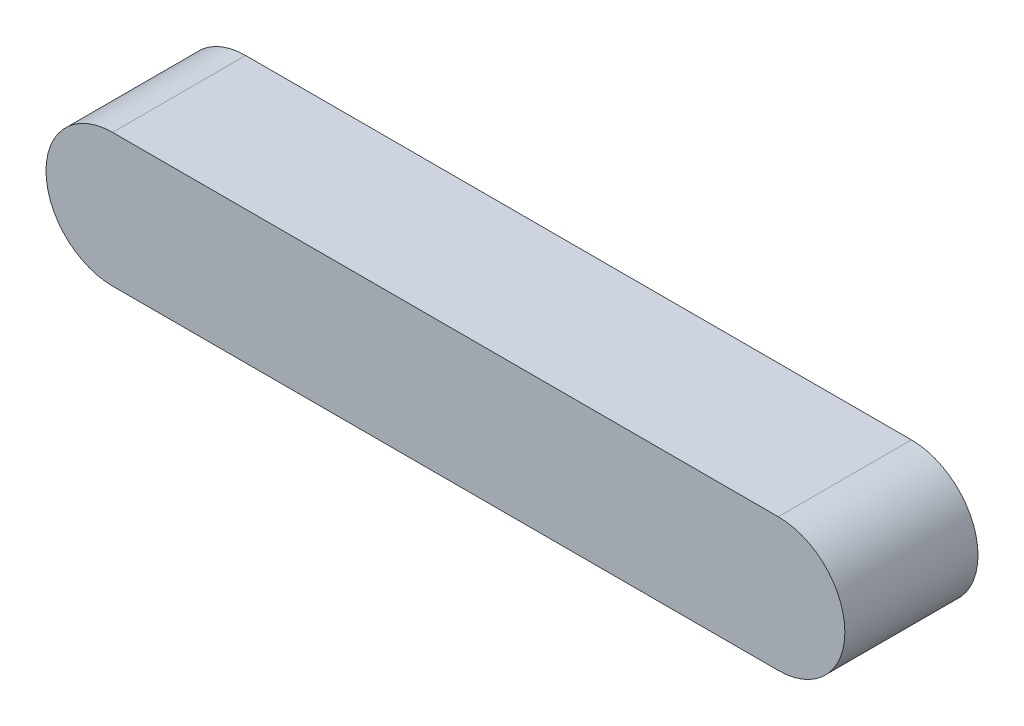
ISO-10303-21;
HEADER;
FILE_DESCRIPTION(('STEP AP214'),'2;1');
FILE_NAME('part.step','',(''),(''),'','','');
FILE_SCHEMA(('AUTOMOTIVE_DESIGN { 1 0 10303 214 1 1 1 1 }'));
ENDSEC;
DATA;
#1=APPLICATION_CONTEXT('core data for automotive mechanical design processes');
#2=APPLICATION_PROTOCOL_DEFINITION('international standard','automotive_design',2000,#1);
#3=PRODUCT_CONTEXT('',#1,'mechanical');
#4=PRODUCT('Part','Part','',(#3));
#5=PRODUCT_RELATED_PRODUCT_CATEGORY('part','',(#4));
#6=PRODUCT_DEFINITION_FORMATION('','',#4);
#7=PRODUCT_DEFINITION_CONTEXT('part definition',#1,'design');
#8=PRODUCT_DEFINITION('design','',#6,#7);
#9=PRODUCT_DEFINITION_SHAPE('','',#8);
#10=(LENGTH_UNIT() NAMED_UNIT(*) SI_UNIT(.MILLI.,.METRE.));
#11=(NAMED_UNIT(*) PLANE_ANGLE_UNIT() SI_UNIT($,.RADIAN.));
#12=(NAMED_UNIT(*) SI_UNIT($,.STERADIAN.) SOLID_ANGLE_UNIT());
#13=UNCERTAINTY_MEASURE_WITH_UNIT(LENGTH_MEASURE(1.E-05),#10,'distance_accuracy_value','');
#14=(GEOMETRIC_REPRESENTATION_CONTEXT(3) GLOBAL_UNCERTAINTY_ASSIGNED_CONTEXT((#13)) GLOBAL_UNIT_ASSIGNED_CONTEXT((#10,
#11,#12)) REPRESENTATION_CONTEXT('',''));
#15=CARTESIAN_POINT('',(0.,0.,0.));
#16=DIRECTION('',(0.,0.,1.));
#17=DIRECTION('',(1.,0.,0.));
#18=AXIS2_PLACEMENT_3D('',#15,#16,#17);
#19=CARTESIAN_POINT('',(0.,0.,12.7));
#20=DIRECTION('',(0.,0.,-1.));
#21=DIRECTION('',(-1.,0.,0.));
#22=AXIS2_PLACEMENT_3D('',#19,#20,#21);
#23=CYLINDRICAL_SURFACE('',#22,6.35);
#24=CARTESIAN_POINT('',(0.,0.,0.));
#25=DIRECTION('',(0.,0.,1.));
#26=DIRECTION('',(1.,0.,0.));
#27=AXIS2_PLACEMENT_3D('',#24,#25,#26);
#28=CIRCLE('',#27,6.35);
#29=CARTESIAN_POINT('',(0.,6.35,0.));
#30=VERTEX_POINT('',#29);
#31=CARTESIAN_POINT('',(0.,-6.35,0.));
#32=VERTEX_POINT('',#31);
#33=EDGE_CURVE('E104',#30,#32,#28,.T.);
#34=ORIENTED_EDGE('',*,*,#33,.T.);
#35=DIRECTION('',(0.,0.,-1.));
#36=VECTOR('',#35,1.);
#37=CARTESIAN_POINT('',(0.,-6.35,12.7));
#38=LINE('',#37,#36);
#39=CARTESIAN_POINT('',(0.,-6.35,12.7));
#40=VERTEX_POINT('',#39);
#41=EDGE_CURVE('E11',#40,#32,#38,.T.);
#42=ORIENTED_EDGE('',*,*,#41,.F.);
#43=CARTESIAN_POINT('',(0.,0.,12.7));
#44=DIRECTION('',(0.,0.,1.));
#45=DIRECTION('',(1.,0.,0.));
#46=AXIS2_PLACEMENT_3D('',#43,#44,#45);
#47=CIRCLE('',#46,6.35);
#48=CARTESIAN_POINT('',(0.,6.35,12.7));
#49=VERTEX_POINT('',#48);
#50=EDGE_CURVE('E92',#49,#40,#47,.T.);
#51=ORIENTED_EDGE('',*,*,#50,.F.);
#52=DIRECTION('',(0.,0.,-1.));
#53=VECTOR('',#52,1.);
#54=CARTESIAN_POINT('',(0.,6.35,12.7));
#55=LINE('',#54,#53);
#56=EDGE_CURVE('E100',#49,#30,#55,.T.);
#57=ORIENTED_EDGE('',*,*,#56,.T.);
#58=EDGE_LOOP('',(#34,#42,#51,#57));
#59=FACE_BOUND('',#58,.T.);
#60=ADVANCED_FACE('F41',(#59),#23,.T.);
#61=CARTESIAN_POINT('',(0.,-6.35,12.7));
#62=DIRECTION('',(0.,1.,0.));
#63=DIRECTION('',(0.,0.,1.));
#64=AXIS2_PLACEMENT_3D('',#61,#62,#63);
#65=PLANE('',#64);
#66=DIRECTION('',(1.,0.,0.));
#67=VECTOR('',#66,1.);
#68=CARTESIAN_POINT('',(0.,-6.35,0.));
#69=LINE('',#68,#67);
#70=CARTESIAN_POINT('',(63.5,-6.35,0.));
#71=VERTEX_POINT('',#70);
#72=EDGE_CURVE('E96',#32,#71,#69,.T.);
#73=ORIENTED_EDGE('',*,*,#72,.T.);
#74=DIRECTION('',(0.,0.,-1.));
#75=VECTOR('',#74,1.);
#76=CARTESIAN_POINT('',(63.5,-6.35,12.7));
#77=LINE('',#76,#75);
#78=CARTESIAN_POINT('',(63.5,-6.35,12.7));
#79=VERTEX_POINT('',#78);
#80=EDGE_CURVE('E49',#79,#71,#77,.T.);
#81=ORIENTED_EDGE('',*,*,#80,.F.);
#82=DIRECTION('',(1.,0.,0.));
#83=VECTOR('',#82,1.);
#84=CARTESIAN_POINT('',(0.,-6.35,12.7));
#85=LINE('',#84,#83);
#86=EDGE_CURVE('E87',#40,#79,#85,.T.);
#87=ORIENTED_EDGE('',*,*,#86,.F.);
#88=ORIENTED_EDGE('',*,*,#41,.T.);
#89=EDGE_LOOP('',(#73,#81,#87,#88));
#90=FACE_BOUND('',#89,.T.);
#91=ADVANCED_FACE('F95',(#90),#65,.F.);
#92=CARTESIAN_POINT('',(63.5,0.,12.7));
#93=DIRECTION('',(0.,0.,-1.));
#94=DIRECTION('',(-1.,0.,0.));
#95=AXIS2_PLACEMENT_3D('',#92,#93,#94);
#96=CYLINDRICAL_SURFACE('',#95,6.35);
#97=CARTESIAN_POINT('',(63.5,0.,0.));
#98=DIRECTION('',(0.,0.,1.));
#99=DIRECTION('',(1.,0.,0.));
#100=AXIS2_PLACEMENT_3D('',#97,#98,#99);
#101=CIRCLE('',#100,6.35);
#102=CARTESIAN_POINT('',(63.5,6.35,0.));
#103=VERTEX_POINT('',#102);
#104=EDGE_CURVE('E74',#71,#103,#101,.T.);
#105=ORIENTED_EDGE('',*,*,#104,.T.);
#106=DIRECTION('',(0.,0.,-1.));
#107=VECTOR('',#106,1.);
#108=CARTESIAN_POINT('',(63.5,6.35,12.7));
#109=LINE('',#108,#107);
#110=CARTESIAN_POINT('',(63.5,6.35,12.7));
#111=VERTEX_POINT('',#110);
#112=EDGE_CURVE('E97',#111,#103,#109,.T.);
#113=ORIENTED_EDGE('',*,*,#112,.F.);
#114=CARTESIAN_POINT('',(63.5,0.,12.7));
#115=DIRECTION('',(0.,0.,1.));
#116=DIRECTION('',(1.,0.,0.));
#117=AXIS2_PLACEMENT_3D('',#114,#115,#116);
#118=CIRCLE('',#117,6.35);
#119=EDGE_CURVE('E90',#79,#111,#118,.T.);
#120=ORIENTED_EDGE('',*,*,#119,.F.);
#121=ORIENTED_EDGE('',*,*,#80,.T.);
#122=EDGE_LOOP('',(#105,#113,#120,#121));
#123=FACE_BOUND('',#122,.T.);
#124=ADVANCED_FACE('F98',(#123),#96,.T.);
#125=CARTESIAN_POINT('',(0.,6.35,12.7));
#126=DIRECTION('',(0.,-1.,0.));
#127=DIRECTION('',(0.,0.,-1.));
#128=AXIS2_PLACEMENT_3D('',#125,#126,#127);
#129=PLANE('',#128);
#130=DIRECTION('',(-1.,0.,0.));
#131=VECTOR('',#130,1.);
#132=CARTESIAN_POINT('',(0.,6.35,0.));
#133=LINE('',#132,#131);
#134=EDGE_CURVE('E80',#103,#30,#133,.T.);
#135=ORIENTED_EDGE('',*,*,#134,.T.);
#136=ORIENTED_EDGE('',*,*,#56,.F.);
#137=DIRECTION('',(-1.,0.,0.));
#138=VECTOR('',#137,1.);
#139=CARTESIAN_POINT('',(0.,6.35,12.7));
#140=LINE('',#139,#138);
#141=EDGE_CURVE('E57',#111,#49,#140,.T.);
#142=ORIENTED_EDGE('',*,*,#141,.F.);
#143=ORIENTED_EDGE('',*,*,#112,.T.);
#144=EDGE_LOOP('',(#135,#136,#142,#143));
#145=FACE_BOUND('',#144,.T.);
#146=ADVANCED_FACE('F111',(#145),#129,.F.);
#147=CARTESIAN_POINT('',(0.,0.,12.7));
#148=DIRECTION('',(0.,0.,1.));
#149=DIRECTION('',(1.,0.,0.));
#150=AXIS2_PLACEMENT_3D('',#147,#148,#149);
#151=PLANE('',#150);
#152=ORIENTED_EDGE('',*,*,#50,.T.);
#153=ORIENTED_EDGE('',*,*,#86,.T.);
#154=ORIENTED_EDGE('',*,*,#119,.T.);
#155=ORIENTED_EDGE('',*,*,#141,.T.);
#156=EDGE_LOOP('',(#152,#153,#154,#155));
#157=FACE_BOUND('',#156,.T.);
#158=ADVANCED_FACE('F88',(#157),#151,.T.);
#159=CARTESIAN_POINT('',(0.,0.,0.));
#160=DIRECTION('',(0.,0.,1.));
#161=DIRECTION('',(1.,0.,0.));
#162=AXIS2_PLACEMENT_3D('',#159,#160,#161);
#163=PLANE('',#162);
#164=ORIENTED_EDGE('',*,*,#33,.F.);
#165=ORIENTED_EDGE('',*,*,#134,.F.);
#166=ORIENTED_EDGE('',*,*,#104,.F.);
#167=ORIENTED_EDGE('',*,*,#72,.F.);
#168=EDGE_LOOP('',(#164,#165,#166,#167));
#169=FACE_BOUND('',#168,.T.);
#170=ADVANCED_FACE('F114',(#169),#163,.F.);
#171=CLOSED_SHELL('',(#60,#91,#124,#146,#158,#170));
#172=MANIFOLD_SOLID_BREP('B2',#171);
#173=ADVANCED_BREP_SHAPE_REPRESENTATION('',(#18,#172),#14);
#174=SHAPE_DEFINITION_REPRESENTATION(#9,#173);
ENDSEC;
END-ISO-10303-21;
